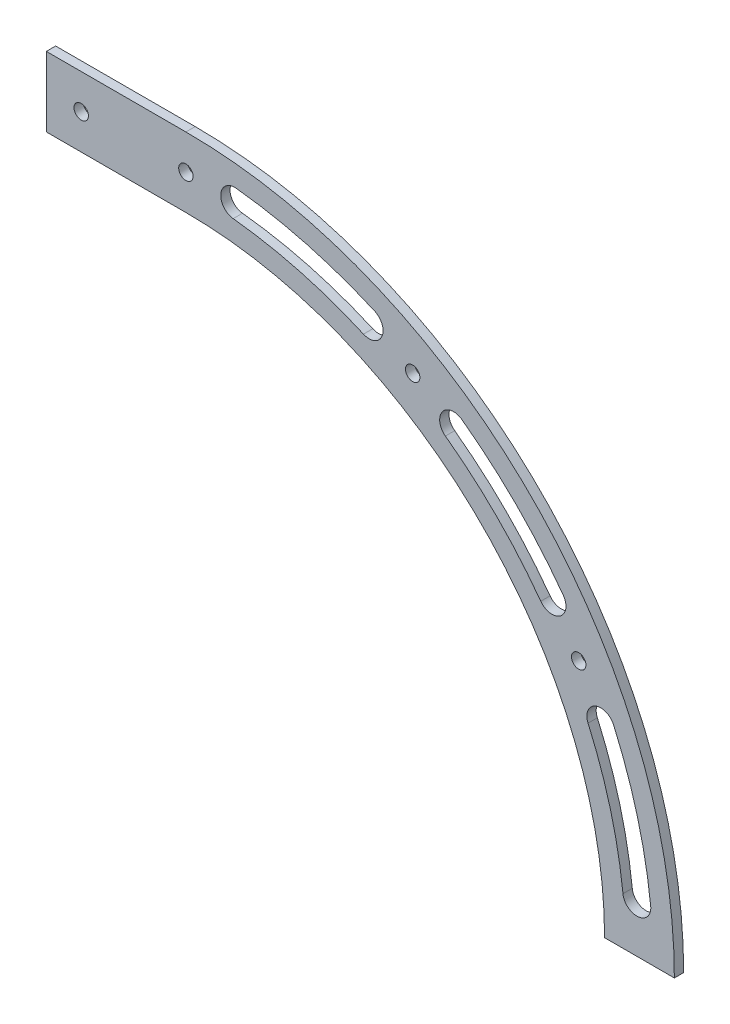
ISO-10303-21;
HEADER;
FILE_DESCRIPTION(('STEP AP214'),'2;1');
FILE_NAME('part.step','',(''),(''),'','','');
FILE_SCHEMA(('AUTOMOTIVE_DESIGN { 1 0 10303 214 1 1 1 1 }'));
ENDSEC;
DATA;
#1=APPLICATION_CONTEXT('core data for automotive mechanical design processes');
#2=APPLICATION_PROTOCOL_DEFINITION('international standard','automotive_design',2000,#1);
#3=PRODUCT_CONTEXT('',#1,'mechanical');
#4=PRODUCT('Part','Part','',(#3));
#5=PRODUCT_RELATED_PRODUCT_CATEGORY('part','',(#4));
#6=PRODUCT_DEFINITION_FORMATION('','',#4);
#7=PRODUCT_DEFINITION_CONTEXT('part definition',#1,'design');
#8=PRODUCT_DEFINITION('design','',#6,#7);
#9=PRODUCT_DEFINITION_SHAPE('','',#8);
#10=(LENGTH_UNIT() NAMED_UNIT(*) SI_UNIT(.MILLI.,.METRE.));
#11=(NAMED_UNIT(*) PLANE_ANGLE_UNIT() SI_UNIT($,.RADIAN.));
#12=(NAMED_UNIT(*) SI_UNIT($,.STERADIAN.) SOLID_ANGLE_UNIT());
#13=UNCERTAINTY_MEASURE_WITH_UNIT(LENGTH_MEASURE(1.E-05),#10,'distance_accuracy_value','');
#14=(GEOMETRIC_REPRESENTATION_CONTEXT(3) GLOBAL_UNCERTAINTY_ASSIGNED_CONTEXT((#13)) GLOBAL_UNIT_ASSIGNED_CONTEXT((#10,
#11,#12)) REPRESENTATION_CONTEXT('',''));
#15=CARTESIAN_POINT('',(0.,0.,0.));
#16=DIRECTION('',(0.,0.,1.));
#17=DIRECTION('',(1.,0.,0.));
#18=AXIS2_PLACEMENT_3D('',#15,#16,#17);
#19=CARTESIAN_POINT('',(0.,0.,0.));
#20=DIRECTION('',(0.,0.,1.));
#21=DIRECTION('',(-1.,0.,0.));
#22=AXIS2_PLACEMENT_3D('',#19,#20,#21);
#23=PLANE('',#22);
#24=CARTESIAN_POINT('',(0.,97.4999999999999,0.));
#25=DIRECTION('',(0.,0.,1.));
#26=DIRECTION('',(1.,0.,0.));
#27=AXIS2_PLACEMENT_3D('',#24,#25,#26);
#28=CIRCLE('',#27,1.55);
#29=CARTESIAN_POINT('',(1.55,97.4999999999999,0.));
#30=VERTEX_POINT('',#29);
#31=EDGE_CURVE('E467',#30,#30,#28,.T.);
#32=ORIENTED_EDGE('',*,*,#31,.F.);
#33=EDGE_LOOP('',(#32));
#34=FACE_BOUND('',#33,.T.);
#35=CARTESIAN_POINT('',(-22.5,97.4999999999999,0.));
#36=DIRECTION('',(0.,0.,1.));
#37=DIRECTION('',(1.,0.,0.));
#38=AXIS2_PLACEMENT_3D('',#35,#36,#37);
#39=CIRCLE('',#38,1.55);
#40=CARTESIAN_POINT('',(-20.95,97.4999999999999,0.));
#41=VERTEX_POINT('',#40);
#42=EDGE_CURVE('E483',#41,#41,#39,.T.);
#43=ORIENTED_EDGE('',*,*,#42,.F.);
#44=EDGE_LOOP('',(#43));
#45=FACE_BOUND('',#44,.T.);
#46=CARTESIAN_POINT('',(39.382176801012,89.1924556810375,0.));
#47=DIRECTION('',(0.,0.,-1.));
#48=DIRECTION('',(-1.,0.,0.));
#49=AXIS2_PLACEMENT_3D('',#46,#47,#48);
#50=CIRCLE('',#49,3.);
#51=CARTESIAN_POINT('',(40.593936087197,91.9368389327617,0.));
#52=VERTEX_POINT('',#51);
#53=CARTESIAN_POINT('',(38.170417514827,86.4480724293132,0.));
#54=VERTEX_POINT('',#53);
#55=EDGE_CURVE('E11',#52,#54,#50,.T.);
#56=ORIENTED_EDGE('',*,*,#55,.T.);
#57=CARTESIAN_POINT('',(0.,0.,0.));
#58=DIRECTION('',(0.,0.,-1.));
#59=DIRECTION('',(-1.,0.,0.));
#60=AXIS2_PLACEMENT_3D('',#57,#58,#59);
#61=CIRCLE('',#60,94.5);
#62=CARTESIAN_POINT('',(10.1674849737587,93.9514355893958,0.));
#63=VERTEX_POINT('',#62);
#64=EDGE_CURVE('E56',#54,#63,#61,.F.);
#65=ORIENTED_EDGE('',*,*,#64,.T.);
#66=CARTESIAN_POINT('',(10.4902622745129,96.934020846202,0.));
#67=DIRECTION('',(0.,0.,-1.));
#68=DIRECTION('',(-1.,0.,0.));
#69=AXIS2_PLACEMENT_3D('',#66,#67,#68);
#70=CIRCLE('',#69,3.);
#71=CARTESIAN_POINT('',(10.8130395752672,99.9166061030083,0.));
#72=VERTEX_POINT('',#71);
#73=EDGE_CURVE('E380',#63,#72,#70,.T.);
#74=ORIENTED_EDGE('',*,*,#73,.T.);
#75=CARTESIAN_POINT('',(0.,0.,0.));
#76=DIRECTION('',(0.,0.,-1.));
#77=DIRECTION('',(-1.,0.,0.));
#78=AXIS2_PLACEMENT_3D('',#75,#76,#77);
#79=CIRCLE('',#78,100.5);
#80=EDGE_CURVE('E370',#72,#52,#79,.T.);
#81=ORIENTED_EDGE('',*,*,#80,.T.);
#82=EDGE_LOOP('',(#56,#65,#74,#81));
#83=FACE_BOUND('',#82,.T.);
#84=CARTESIAN_POINT('',(84.4374768689824,48.7500000000007,0.));
#85=DIRECTION('',(0.,0.,-1.));
#86=DIRECTION('',(-1.,0.,0.));
#87=AXIS2_PLACEMENT_3D('',#84,#85,#86);
#88=CIRCLE('',#87,1.54999999999999);
#89=CARTESIAN_POINT('',(82.8874768689824,48.7500000000007,0.));
#90=VERTEX_POINT('',#89);
#91=EDGE_CURVE('E322',#90,#90,#88,.T.);
#92=ORIENTED_EDGE('',*,*,#91,.T.);
#93=EDGE_LOOP('',(#92));
#94=FACE_BOUND('',#93,.T.);
#95=CARTESIAN_POINT('',(48.7500000000004,84.4374768689825,0.));
#96=DIRECTION('',(0.,0.,-1.));
#97=DIRECTION('',(-1.,0.,0.));
#98=AXIS2_PLACEMENT_3D('',#95,#96,#97);
#99=CIRCLE('',#98,1.54999999999999);
#100=CARTESIAN_POINT('',(47.2000000000004,84.4374768689825,0.));
#101=VERTEX_POINT('',#100);
#102=EDGE_CURVE('E275',#101,#101,#99,.T.);
#103=ORIENTED_EDGE('',*,*,#102,.T.);
#104=EDGE_LOOP('',(#103));
#105=FACE_BOUND('',#104,.T.);
#106=CARTESIAN_POINT('',(96.9340208462021,10.4902622745126,0.));
#107=DIRECTION('',(0.,0.,-1.));
#108=DIRECTION('',(-1.,0.,0.));
#109=AXIS2_PLACEMENT_3D('',#106,#107,#108);
#110=CIRCLE('',#109,3.);
#111=CARTESIAN_POINT('',(99.9166061030083,10.8130395752669,0.));
#112=VERTEX_POINT('',#111);
#113=CARTESIAN_POINT('',(93.9514355893959,10.1674849737584,0.));
#114=VERTEX_POINT('',#113);
#115=EDGE_CURVE('E366',#112,#114,#110,.T.);
#116=ORIENTED_EDGE('',*,*,#115,.T.);
#117=CARTESIAN_POINT('',(0.,0.,0.));
#118=DIRECTION('',(0.,0.,-1.));
#119=DIRECTION('',(-1.,0.,0.));
#120=AXIS2_PLACEMENT_3D('',#117,#118,#119);
#121=CIRCLE('',#120,94.5);
#122=CARTESIAN_POINT('',(86.4480724293134,38.1704175148268,0.));
#123=VERTEX_POINT('',#122);
#124=EDGE_CURVE('E362',#114,#123,#121,.F.);
#125=ORIENTED_EDGE('',*,*,#124,.T.);
#126=CARTESIAN_POINT('',(89.1924556810376,39.3821768010117,0.));
#127=DIRECTION('',(0.,0.,-1.));
#128=DIRECTION('',(-1.,0.,0.));
#129=AXIS2_PLACEMENT_3D('',#126,#127,#128);
#130=CIRCLE('',#129,3.);
#131=CARTESIAN_POINT('',(91.9368389327618,40.5939360871967,0.));
#132=VERTEX_POINT('',#131);
#133=EDGE_CURVE('E358',#123,#132,#130,.T.);
#134=ORIENTED_EDGE('',*,*,#133,.T.);
#135=CARTESIAN_POINT('',(0.,0.,0.));
#136=DIRECTION('',(0.,0.,-1.));
#137=DIRECTION('',(-1.,0.,0.));
#138=AXIS2_PLACEMENT_3D('',#135,#136,#137);
#139=CIRCLE('',#138,100.5);
#140=EDGE_CURVE('E354',#132,#112,#139,.T.);
#141=ORIENTED_EDGE('',*,*,#140,.T.);
#142=EDGE_LOOP('',(#116,#125,#134,#141));
#143=FACE_BOUND('',#142,.T.);
#144=CARTESIAN_POINT('',(78.702193406525,57.5518440451906,0.));
#145=DIRECTION('',(0.,0.,-1.));
#146=DIRECTION('',(-1.,0.,0.));
#147=AXIS2_PLACEMENT_3D('',#144,#145,#146);
#148=CIRCLE('',#147,2.99999999999999);
#149=CARTESIAN_POINT('',(81.1237993574949,59.3226700158118,0.));
#150=VERTEX_POINT('',#149);
#151=CARTESIAN_POINT('',(76.280587455555,55.7810180745693,0.));
#152=VERTEX_POINT('',#151);
#153=EDGE_CURVE('E350',#150,#152,#148,.T.);
#154=ORIENTED_EDGE('',*,*,#153,.T.);
#155=CARTESIAN_POINT('',(0.,0.,0.));
#156=DIRECTION('',(0.,0.,-1.));
#157=DIRECTION('',(-1.,0.,0.));
#158=AXIS2_PLACEMENT_3D('',#155,#156,#157);
#159=CIRCLE('',#158,94.5);
#160=CARTESIAN_POINT('',(55.781018074569,76.2805874555552,0.));
#161=VERTEX_POINT('',#160);
#162=EDGE_CURVE('E346',#152,#161,#159,.F.);
#163=ORIENTED_EDGE('',*,*,#162,.T.);
#164=CARTESIAN_POINT('',(57.5518440451903,78.7021934065252,0.));
#165=DIRECTION('',(0.,0.,-1.));
#166=DIRECTION('',(-1.,0.,0.));
#167=AXIS2_PLACEMENT_3D('',#164,#165,#166);
#168=CIRCLE('',#167,2.99999999999999);
#169=CARTESIAN_POINT('',(59.3226700158115,81.1237993574952,0.));
#170=VERTEX_POINT('',#169);
#171=EDGE_CURVE('E342',#161,#170,#168,.T.);
#172=ORIENTED_EDGE('',*,*,#171,.T.);
#173=CARTESIAN_POINT('',(0.,0.,0.));
#174=DIRECTION('',(0.,0.,-1.));
#175=DIRECTION('',(-1.,0.,0.));
#176=AXIS2_PLACEMENT_3D('',#173,#174,#175);
#177=CIRCLE('',#176,100.5);
#178=EDGE_CURVE('E338',#170,#150,#177,.T.);
#179=ORIENTED_EDGE('',*,*,#178,.T.);
#180=EDGE_LOOP('',(#154,#163,#172,#179));
#181=FACE_BOUND('',#180,.T.);
#182=CARTESIAN_POINT('',(0.,0.,0.));
#183=DIRECTION('',(0.,0.,1.));
#184=DIRECTION('',(-1.,0.,0.));
#185=AXIS2_PLACEMENT_3D('',#182,#183,#184);
#186=CIRCLE('',#185,105.);
#187=CARTESIAN_POINT('',(105.,0.,0.));
#188=VERTEX_POINT('',#187);
#189=CARTESIAN_POINT('',(0.,105.,0.));
#190=VERTEX_POINT('',#189);
#191=EDGE_CURVE('E197',#188,#190,#186,.T.);
#192=ORIENTED_EDGE('',*,*,#191,.T.);
#193=DIRECTION('',(-1.,0.,0.));
#194=VECTOR('',#193,1.);
#195=CARTESIAN_POINT('',(-3.66605540578529E-13,105.,0.));
#196=LINE('',#195,#194);
#197=CARTESIAN_POINT('',(-30.,105.,0.));
#198=VERTEX_POINT('',#197);
#199=EDGE_CURVE('E178',#190,#198,#196,.T.);
#200=ORIENTED_EDGE('',*,*,#199,.T.);
#201=DIRECTION('',(0.,-1.,0.));
#202=VECTOR('',#201,1.);
#203=CARTESIAN_POINT('',(-30.,105.,0.));
#204=LINE('',#203,#202);
#205=CARTESIAN_POINT('',(-30.,89.9999999999999,0.));
#206=VERTEX_POINT('',#205);
#207=EDGE_CURVE('E185',#198,#206,#204,.T.);
#208=ORIENTED_EDGE('',*,*,#207,.T.);
#209=DIRECTION('',(1.,0.,0.));
#210=VECTOR('',#209,1.);
#211=CARTESIAN_POINT('',(-3.66605540578529E-13,89.9999999999999,0.));
#212=LINE('',#211,#210);
#213=CARTESIAN_POINT('',(-3.66605540578529E-13,89.9999999999999,0.));
#214=VERTEX_POINT('',#213);
#215=EDGE_CURVE('E207',#206,#214,#212,.T.);
#216=ORIENTED_EDGE('',*,*,#215,.T.);
#217=CARTESIAN_POINT('',(0.,0.,0.));
#218=DIRECTION('',(0.,0.,-1.));
#219=DIRECTION('',(-1.,0.,0.));
#220=AXIS2_PLACEMENT_3D('',#217,#218,#219);
#221=CIRCLE('',#220,90.);
#222=CARTESIAN_POINT('',(90.,0.,0.));
#223=VERTEX_POINT('',#222);
#224=EDGE_CURVE('E321',#214,#223,#221,.T.);
#225=ORIENTED_EDGE('',*,*,#224,.T.);
#226=DIRECTION('',(-1.,0.,0.));
#227=VECTOR('',#226,1.);
#228=CARTESIAN_POINT('',(0.,0.,0.));
#229=LINE('',#228,#227);
#230=EDGE_CURVE('E266',#188,#223,#229,.T.);
#231=ORIENTED_EDGE('',*,*,#230,.F.);
#232=EDGE_LOOP('',(#192,#200,#208,#216,#225,#231));
#233=FACE_BOUND('',#232,.T.);
#234=ADVANCED_FACE('F47',(#34,#45,#83,#94,#105,#143,#181,#233),#23,.T.);
#235=CARTESIAN_POINT('',(0.,0.,-15.));
#236=DIRECTION('',(0.,0.,1.));
#237=DIRECTION('',(-1.,0.,0.));
#238=AXIS2_PLACEMENT_3D('',#235,#236,#237);
#239=CYLINDRICAL_SURFACE('',#238,105.);
#240=DIRECTION('',(0.,0.,1.));
#241=VECTOR('',#240,1.);
#242=CARTESIAN_POINT('',(0.,105.,-15.));
#243=LINE('',#242,#241);
#244=CARTESIAN_POINT('',(0.,105.,-2.));
#245=VERTEX_POINT('',#244);
#246=EDGE_CURVE('E335',#245,#190,#243,.T.);
#247=ORIENTED_EDGE('',*,*,#246,.T.);
#248=ORIENTED_EDGE('',*,*,#191,.F.);
#249=DIRECTION('',(0.,0.,1.));
#250=VECTOR('',#249,1.);
#251=CARTESIAN_POINT('',(105.,0.,-15.));
#252=LINE('',#251,#250);
#253=CARTESIAN_POINT('',(105.,0.,-2.));
#254=VERTEX_POINT('',#253);
#255=EDGE_CURVE('E326',#254,#188,#252,.T.);
#256=ORIENTED_EDGE('',*,*,#255,.F.);
#257=CARTESIAN_POINT('',(0.,0.,-2.));
#258=DIRECTION('',(0.,0.,1.));
#259=DIRECTION('',(-1.,0.,0.));
#260=AXIS2_PLACEMENT_3D('',#257,#258,#259);
#261=CIRCLE('',#260,105.);
#262=EDGE_CURVE('E209',#254,#245,#261,.T.);
#263=ORIENTED_EDGE('',*,*,#262,.T.);
#264=EDGE_LOOP('',(#247,#248,#256,#263));
#265=FACE_BOUND('',#264,.T.);
#266=ADVANCED_FACE('F49',(#265),#239,.T.);
#267=CARTESIAN_POINT('',(0.,0.,-15.));
#268=DIRECTION('',(0.,0.,1.));
#269=DIRECTION('',(-1.,0.,0.));
#270=AXIS2_PLACEMENT_3D('',#267,#268,#269);
#271=CYLINDRICAL_SURFACE('',#270,90.);
#272=DIRECTION('',(0.,0.,1.));
#273=VECTOR('',#272,1.);
#274=CARTESIAN_POINT('',(90.,0.,-15.));
#275=LINE('',#274,#273);
#276=CARTESIAN_POINT('',(90.,0.,-2.));
#277=VERTEX_POINT('',#276);
#278=EDGE_CURVE('E329',#277,#223,#275,.T.);
#279=ORIENTED_EDGE('',*,*,#278,.T.);
#280=ORIENTED_EDGE('',*,*,#224,.F.);
#281=DIRECTION('',(0.,0.,1.));
#282=VECTOR('',#281,1.);
#283=CARTESIAN_POINT('',(0.,90.,-15.));
#284=LINE('',#283,#282);
#285=CARTESIAN_POINT('',(0.,90.,-2.));
#286=VERTEX_POINT('',#285);
#287=EDGE_CURVE('E332',#286,#214,#284,.T.);
#288=ORIENTED_EDGE('',*,*,#287,.F.);
#289=CARTESIAN_POINT('',(0.,0.,-2.));
#290=DIRECTION('',(0.,0.,-1.));
#291=DIRECTION('',(-1.,0.,0.));
#292=AXIS2_PLACEMENT_3D('',#289,#290,#291);
#293=CIRCLE('',#292,90.);
#294=EDGE_CURVE('E216',#286,#277,#293,.T.);
#295=ORIENTED_EDGE('',*,*,#294,.T.);
#296=EDGE_LOOP('',(#279,#280,#288,#295));
#297=FACE_BOUND('',#296,.T.);
#298=ADVANCED_FACE('F442',(#297),#271,.F.);
#299=CARTESIAN_POINT('',(78.702193406525,57.5518440451906,50.));
#300=DIRECTION('',(0.,0.,-1.));
#301=DIRECTION('',(1.,0.,0.));
#302=AXIS2_PLACEMENT_3D('',#299,#300,#301);
#303=CYLINDRICAL_SURFACE('',#302,2.99999999999999);
#304=DIRECTION('',(0.,0.,-1.));
#305=VECTOR('',#304,1.);
#306=CARTESIAN_POINT('',(76.280587455555,55.7810180745693,50.));
#307=LINE('',#306,#305);
#308=CARTESIAN_POINT('',(76.280587455555,55.7810180745693,-2.));
#309=VERTEX_POINT('',#308);
#310=EDGE_CURVE('E300',#152,#309,#307,.T.);
#311=ORIENTED_EDGE('',*,*,#310,.F.);
#312=ORIENTED_EDGE('',*,*,#153,.F.);
#313=DIRECTION('',(0.,0.,-1.));
#314=VECTOR('',#313,1.);
#315=CARTESIAN_POINT('',(81.1237993574949,59.3226700158118,50.));
#316=LINE('',#315,#314);
#317=CARTESIAN_POINT('',(81.1237993574949,59.3226700158118,-2.));
#318=VERTEX_POINT('',#317);
#319=EDGE_CURVE('E288',#150,#318,#316,.T.);
#320=ORIENTED_EDGE('',*,*,#319,.T.);
#321=CARTESIAN_POINT('',(78.702193406525,57.5518440451906,-2.));
#322=DIRECTION('',(0.,0.,-1.));
#323=DIRECTION('',(-1.,0.,0.));
#324=AXIS2_PLACEMENT_3D('',#321,#322,#323);
#325=CIRCLE('',#324,2.99999999999999);
#326=EDGE_CURVE('E263',#309,#318,#325,.F.);
#327=ORIENTED_EDGE('',*,*,#326,.F.);
#328=EDGE_LOOP('',(#311,#312,#320,#327));
#329=FACE_BOUND('',#328,.T.);
#330=ADVANCED_FACE('F416',(#329),#303,.F.);
#331=CARTESIAN_POINT('',(0.,0.,50.));
#332=DIRECTION('',(0.,0.,-1.));
#333=DIRECTION('',(1.,0.,0.));
#334=AXIS2_PLACEMENT_3D('',#331,#332,#333);
#335=CYLINDRICAL_SURFACE('',#334,94.5);
#336=DIRECTION('',(0.,0.,-1.));
#337=VECTOR('',#336,1.);
#338=CARTESIAN_POINT('',(55.781018074569,76.2805874555552,50.));
#339=LINE('',#338,#337);
#340=CARTESIAN_POINT('',(55.781018074569,76.2805874555552,-2.));
#341=VERTEX_POINT('',#340);
#342=EDGE_CURVE('E296',#161,#341,#339,.T.);
#343=ORIENTED_EDGE('',*,*,#342,.F.);
#344=ORIENTED_EDGE('',*,*,#162,.F.);
#345=ORIENTED_EDGE('',*,*,#310,.T.);
#346=CARTESIAN_POINT('',(0.,0.,-2.));
#347=DIRECTION('',(0.,0.,-1.));
#348=DIRECTION('',(-1.,0.,0.));
#349=AXIS2_PLACEMENT_3D('',#346,#347,#348);
#350=CIRCLE('',#349,94.5);
#351=EDGE_CURVE('E260',#341,#309,#350,.T.);
#352=ORIENTED_EDGE('',*,*,#351,.F.);
#353=EDGE_LOOP('',(#343,#344,#345,#352));
#354=FACE_BOUND('',#353,.T.);
#355=ADVANCED_FACE('F419',(#354),#335,.T.);
#356=CARTESIAN_POINT('',(57.5518440451903,78.7021934065252,50.));
#357=DIRECTION('',(0.,0.,-1.));
#358=DIRECTION('',(1.,0.,0.));
#359=AXIS2_PLACEMENT_3D('',#356,#357,#358);
#360=CYLINDRICAL_SURFACE('',#359,2.99999999999999);
#361=DIRECTION('',(0.,0.,-1.));
#362=VECTOR('',#361,1.);
#363=CARTESIAN_POINT('',(59.3226700158115,81.1237993574952,50.));
#364=LINE('',#363,#362);
#365=CARTESIAN_POINT('',(59.3226700158115,81.1237993574952,-2.));
#366=VERTEX_POINT('',#365);
#367=EDGE_CURVE('E292',#170,#366,#364,.T.);
#368=ORIENTED_EDGE('',*,*,#367,.F.);
#369=ORIENTED_EDGE('',*,*,#171,.F.);
#370=ORIENTED_EDGE('',*,*,#342,.T.);
#371=CARTESIAN_POINT('',(57.5518440451903,78.7021934065252,-2.));
#372=DIRECTION('',(0.,0.,-1.));
#373=DIRECTION('',(-1.,0.,0.));
#374=AXIS2_PLACEMENT_3D('',#371,#372,#373);
#375=CIRCLE('',#374,2.99999999999999);
#376=EDGE_CURVE('E257',#366,#341,#375,.F.);
#377=ORIENTED_EDGE('',*,*,#376,.F.);
#378=EDGE_LOOP('',(#368,#369,#370,#377));
#379=FACE_BOUND('',#378,.T.);
#380=ADVANCED_FACE('F426',(#379),#360,.F.);
#381=CARTESIAN_POINT('',(0.,0.,50.));
#382=DIRECTION('',(0.,0.,-1.));
#383=DIRECTION('',(1.,0.,0.));
#384=AXIS2_PLACEMENT_3D('',#381,#382,#383);
#385=CYLINDRICAL_SURFACE('',#384,100.5);
#386=ORIENTED_EDGE('',*,*,#319,.F.);
#387=ORIENTED_EDGE('',*,*,#178,.F.);
#388=ORIENTED_EDGE('',*,*,#367,.T.);
#389=CARTESIAN_POINT('',(0.,0.,-2.));
#390=DIRECTION('',(0.,0.,-1.));
#391=DIRECTION('',(-1.,0.,0.));
#392=AXIS2_PLACEMENT_3D('',#389,#390,#391);
#393=CIRCLE('',#392,100.5);
#394=EDGE_CURVE('E63',#318,#366,#393,.F.);
#395=ORIENTED_EDGE('',*,*,#394,.F.);
#396=EDGE_LOOP('',(#386,#387,#388,#395));
#397=FACE_BOUND('',#396,.T.);
#398=ADVANCED_FACE('F424',(#397),#385,.F.);
#399=CARTESIAN_POINT('',(96.9340208462021,10.4902622745126,50.));
#400=DIRECTION('',(0.,0.,-1.));
#401=DIRECTION('',(1.,0.,0.));
#402=AXIS2_PLACEMENT_3D('',#399,#400,#401);
#403=CYLINDRICAL_SURFACE('',#402,3.);
#404=DIRECTION('',(0.,0.,-1.));
#405=VECTOR('',#404,1.);
#406=CARTESIAN_POINT('',(93.9514355893959,10.1674849737584,50.));
#407=LINE('',#406,#405);
#408=CARTESIAN_POINT('',(93.9514355893959,10.1674849737584,-2.));
#409=VERTEX_POINT('',#408);
#410=EDGE_CURVE('E270',#114,#409,#407,.T.);
#411=ORIENTED_EDGE('',*,*,#410,.F.);
#412=ORIENTED_EDGE('',*,*,#115,.F.);
#413=DIRECTION('',(0.,0.,-1.));
#414=VECTOR('',#413,1.);
#415=CARTESIAN_POINT('',(99.9166061030083,10.8130395752669,50.));
#416=LINE('',#415,#414);
#417=CARTESIAN_POINT('',(99.9166061030083,10.8130395752669,-2.));
#418=VERTEX_POINT('',#417);
#419=EDGE_CURVE('E304',#112,#418,#416,.T.);
#420=ORIENTED_EDGE('',*,*,#419,.T.);
#421=CARTESIAN_POINT('',(96.9340208462021,10.4902622745126,-2.));
#422=DIRECTION('',(0.,0.,-1.));
#423=DIRECTION('',(-1.,0.,0.));
#424=AXIS2_PLACEMENT_3D('',#421,#422,#423);
#425=CIRCLE('',#424,3.);
#426=EDGE_CURVE('E252',#409,#418,#425,.F.);
#427=ORIENTED_EDGE('',*,*,#426,.F.);
#428=EDGE_LOOP('',(#411,#412,#420,#427));
#429=FACE_BOUND('',#428,.T.);
#430=ADVANCED_FACE('F433',(#429),#403,.F.);
#431=CARTESIAN_POINT('',(0.,0.,50.));
#432=DIRECTION('',(0.,0.,-1.));
#433=DIRECTION('',(1.,0.,0.));
#434=AXIS2_PLACEMENT_3D('',#431,#432,#433);
#435=CYLINDRICAL_SURFACE('',#434,94.5);
#436=DIRECTION('',(0.,0.,-1.));
#437=VECTOR('',#436,1.);
#438=CARTESIAN_POINT('',(86.4480724293134,38.1704175148268,50.));
#439=LINE('',#438,#437);
#440=CARTESIAN_POINT('',(86.4480724293134,38.1704175148268,-2.));
#441=VERTEX_POINT('',#440);
#442=EDGE_CURVE('E312',#123,#441,#439,.T.);
#443=ORIENTED_EDGE('',*,*,#442,.F.);
#444=ORIENTED_EDGE('',*,*,#124,.F.);
#445=ORIENTED_EDGE('',*,*,#410,.T.);
#446=CARTESIAN_POINT('',(0.,0.,-2.));
#447=DIRECTION('',(0.,0.,-1.));
#448=DIRECTION('',(-1.,0.,0.));
#449=AXIS2_PLACEMENT_3D('',#446,#447,#448);
#450=CIRCLE('',#449,94.5);
#451=EDGE_CURVE('E249',#441,#409,#450,.T.);
#452=ORIENTED_EDGE('',*,*,#451,.F.);
#453=EDGE_LOOP('',(#443,#444,#445,#452));
#454=FACE_BOUND('',#453,.T.);
#455=ADVANCED_FACE('F447',(#454),#435,.T.);
#456=CARTESIAN_POINT('',(89.1924556810376,39.3821768010117,50.));
#457=DIRECTION('',(0.,0.,-1.));
#458=DIRECTION('',(1.,0.,0.));
#459=AXIS2_PLACEMENT_3D('',#456,#457,#458);
#460=CYLINDRICAL_SURFACE('',#459,3.);
#461=DIRECTION('',(0.,0.,-1.));
#462=VECTOR('',#461,1.);
#463=CARTESIAN_POINT('',(91.9368389327619,40.5939360871967,50.));
#464=LINE('',#463,#462);
#465=CARTESIAN_POINT('',(91.9368389327619,40.5939360871967,-2.));
#466=VERTEX_POINT('',#465);
#467=EDGE_CURVE('E308',#132,#466,#464,.T.);
#468=ORIENTED_EDGE('',*,*,#467,.F.);
#469=ORIENTED_EDGE('',*,*,#133,.F.);
#470=ORIENTED_EDGE('',*,*,#442,.T.);
#471=CARTESIAN_POINT('',(89.1924556810376,39.3821768010117,-2.));
#472=DIRECTION('',(0.,0.,-1.));
#473=DIRECTION('',(-1.,0.,0.));
#474=AXIS2_PLACEMENT_3D('',#471,#472,#473);
#475=CIRCLE('',#474,3.);
#476=EDGE_CURVE('E246',#466,#441,#475,.F.);
#477=ORIENTED_EDGE('',*,*,#476,.F.);
#478=EDGE_LOOP('',(#468,#469,#470,#477));
#479=FACE_BOUND('',#478,.T.);
#480=ADVANCED_FACE('F513',(#479),#460,.F.);
#481=CARTESIAN_POINT('',(0.,0.,50.));
#482=DIRECTION('',(0.,0.,-1.));
#483=DIRECTION('',(1.,0.,0.));
#484=AXIS2_PLACEMENT_3D('',#481,#482,#483);
#485=CYLINDRICAL_SURFACE('',#484,100.5);
#486=ORIENTED_EDGE('',*,*,#419,.F.);
#487=ORIENTED_EDGE('',*,*,#140,.F.);
#488=ORIENTED_EDGE('',*,*,#467,.T.);
#489=CARTESIAN_POINT('',(0.,0.,-2.));
#490=DIRECTION('',(0.,0.,-1.));
#491=DIRECTION('',(-1.,0.,0.));
#492=AXIS2_PLACEMENT_3D('',#489,#490,#491);
#493=CIRCLE('',#492,100.5);
#494=EDGE_CURVE('E71',#418,#466,#493,.F.);
#495=ORIENTED_EDGE('',*,*,#494,.F.);
#496=EDGE_LOOP('',(#486,#487,#488,#495));
#497=FACE_BOUND('',#496,.T.);
#498=ADVANCED_FACE('F515',(#497),#485,.F.);
#499=CARTESIAN_POINT('',(48.7500000000004,84.4374768689825,50.));
#500=DIRECTION('',(0.,0.,-1.));
#501=DIRECTION('',(1.,0.,0.));
#502=AXIS2_PLACEMENT_3D('',#499,#500,#501);
#503=CYLINDRICAL_SURFACE('',#502,1.54999999999999);
#504=CARTESIAN_POINT('',(48.7500000000004,84.4374768689825,-2.));
#505=DIRECTION('',(0.,0.,-1.));
#506=DIRECTION('',(-1.,0.,0.));
#507=AXIS2_PLACEMENT_3D('',#504,#505,#506);
#508=CIRCLE('',#507,1.54999999999999);
#509=CARTESIAN_POINT('',(47.2000000000004,84.4374768689825,-2.));
#510=VERTEX_POINT('',#509);
#511=EDGE_CURVE('E240',#510,#510,#508,.F.);
#512=ORIENTED_EDGE('',*,*,#511,.F.);
#513=EDGE_LOOP('',(#512));
#514=FACE_BOUND('',#513,.T.);
#515=ORIENTED_EDGE('',*,*,#102,.F.);
#516=EDGE_LOOP('',(#515));
#517=FACE_BOUND('',#516,.T.);
#518=ADVANCED_FACE('F500',(#514,#517),#503,.F.);
#519=CARTESIAN_POINT('',(84.4374768689824,48.7500000000007,50.));
#520=DIRECTION('',(0.,0.,-1.));
#521=DIRECTION('',(1.,0.,0.));
#522=AXIS2_PLACEMENT_3D('',#519,#520,#521);
#523=CYLINDRICAL_SURFACE('',#522,1.54999999999999);
#524=CARTESIAN_POINT('',(84.4374768689824,48.7500000000007,-2.));
#525=DIRECTION('',(0.,0.,-1.));
#526=DIRECTION('',(-1.,0.,0.));
#527=AXIS2_PLACEMENT_3D('',#524,#525,#526);
#528=CIRCLE('',#527,1.54999999999999);
#529=CARTESIAN_POINT('',(82.8874768689824,48.7500000000007,-2.));
#530=VERTEX_POINT('',#529);
#531=EDGE_CURVE('E236',#530,#530,#528,.F.);
#532=ORIENTED_EDGE('',*,*,#531,.F.);
#533=EDGE_LOOP('',(#532));
#534=FACE_BOUND('',#533,.T.);
#535=ORIENTED_EDGE('',*,*,#91,.F.);
#536=EDGE_LOOP('',(#535));
#537=FACE_BOUND('',#536,.T.);
#538=ADVANCED_FACE('F497',(#534,#537),#523,.F.);
#539=CARTESIAN_POINT('',(39.382176801012,89.1924556810375,50.));
#540=DIRECTION('',(0.,0.,-1.));
#541=DIRECTION('',(1.,0.,0.));
#542=AXIS2_PLACEMENT_3D('',#539,#540,#541);
#543=CYLINDRICAL_SURFACE('',#542,3.);
#544=DIRECTION('',(0.,0.,-1.));
#545=VECTOR('',#544,1.);
#546=CARTESIAN_POINT('',(38.170417514827,86.4480724293132,50.));
#547=LINE('',#546,#545);
#548=CARTESIAN_POINT('',(38.170417514827,86.4480724293132,-2.));
#549=VERTEX_POINT('',#548);
#550=EDGE_CURVE('E271',#54,#549,#547,.T.);
#551=ORIENTED_EDGE('',*,*,#550,.F.);
#552=ORIENTED_EDGE('',*,*,#55,.F.);
#553=DIRECTION('',(0.,0.,-1.));
#554=VECTOR('',#553,1.);
#555=CARTESIAN_POINT('',(40.593936087197,91.9368389327617,50.));
#556=LINE('',#555,#554);
#557=CARTESIAN_POINT('',(40.593936087197,91.9368389327617,-2.));
#558=VERTEX_POINT('',#557);
#559=EDGE_CURVE('E284',#52,#558,#556,.T.);
#560=ORIENTED_EDGE('',*,*,#559,.T.);
#561=CARTESIAN_POINT('',(39.382176801012,89.1924556810375,-2.));
#562=DIRECTION('',(0.,0.,-1.));
#563=DIRECTION('',(-1.,0.,0.));
#564=AXIS2_PLACEMENT_3D('',#561,#562,#563);
#565=CIRCLE('',#564,3.);
#566=EDGE_CURVE('E232',#549,#558,#565,.F.);
#567=ORIENTED_EDGE('',*,*,#566,.F.);
#568=EDGE_LOOP('',(#551,#552,#560,#567));
#569=FACE_BOUND('',#568,.T.);
#570=ADVANCED_FACE('F400',(#569),#543,.F.);
#571=CARTESIAN_POINT('',(0.,0.,50.));
#572=DIRECTION('',(0.,0.,-1.));
#573=DIRECTION('',(1.,0.,0.));
#574=AXIS2_PLACEMENT_3D('',#571,#572,#573);
#575=CYLINDRICAL_SURFACE('',#574,94.5);
#576=DIRECTION('',(0.,0.,-1.));
#577=VECTOR('',#576,1.);
#578=CARTESIAN_POINT('',(10.1674849737587,93.9514355893958,50.));
#579=LINE('',#578,#577);
#580=CARTESIAN_POINT('',(10.1674849737587,93.9514355893958,-2.));
#581=VERTEX_POINT('',#580);
#582=EDGE_CURVE('E276',#63,#581,#579,.T.);
#583=ORIENTED_EDGE('',*,*,#582,.F.);
#584=ORIENTED_EDGE('',*,*,#64,.F.);
#585=ORIENTED_EDGE('',*,*,#550,.T.);
#586=CARTESIAN_POINT('',(0.,0.,-2.));
#587=DIRECTION('',(0.,0.,-1.));
#588=DIRECTION('',(-1.,0.,0.));
#589=AXIS2_PLACEMENT_3D('',#586,#587,#588);
#590=CIRCLE('',#589,94.5);
#591=EDGE_CURVE('E229',#581,#549,#590,.T.);
#592=ORIENTED_EDGE('',*,*,#591,.F.);
#593=EDGE_LOOP('',(#583,#584,#585,#592));
#594=FACE_BOUND('',#593,.T.);
#595=ADVANCED_FACE('F391',(#594),#575,.T.);
#596=CARTESIAN_POINT('',(10.4902622745129,96.934020846202,50.));
#597=DIRECTION('',(0.,0.,-1.));
#598=DIRECTION('',(1.,0.,0.));
#599=AXIS2_PLACEMENT_3D('',#596,#597,#598);
#600=CYLINDRICAL_SURFACE('',#599,3.);
#601=DIRECTION('',(0.,0.,-1.));
#602=VECTOR('',#601,1.);
#603=CARTESIAN_POINT('',(10.8130395752672,99.9166061030083,50.));
#604=LINE('',#603,#602);
#605=CARTESIAN_POINT('',(10.8130395752672,99.9166061030083,-2.));
#606=VERTEX_POINT('',#605);
#607=EDGE_CURVE('E280',#72,#606,#604,.T.);
#608=ORIENTED_EDGE('',*,*,#607,.F.);
#609=ORIENTED_EDGE('',*,*,#73,.F.);
#610=ORIENTED_EDGE('',*,*,#582,.T.);
#611=CARTESIAN_POINT('',(10.4902622745129,96.934020846202,-2.));
#612=DIRECTION('',(0.,0.,-1.));
#613=DIRECTION('',(-1.,0.,0.));
#614=AXIS2_PLACEMENT_3D('',#611,#612,#613);
#615=CIRCLE('',#614,3.);
#616=EDGE_CURVE('E226',#606,#581,#615,.F.);
#617=ORIENTED_EDGE('',*,*,#616,.F.);
#618=EDGE_LOOP('',(#608,#609,#610,#617));
#619=FACE_BOUND('',#618,.T.);
#620=ADVANCED_FACE('F395',(#619),#600,.F.);
#621=CARTESIAN_POINT('',(0.,0.,50.));
#622=DIRECTION('',(0.,0.,-1.));
#623=DIRECTION('',(1.,0.,0.));
#624=AXIS2_PLACEMENT_3D('',#621,#622,#623);
#625=CYLINDRICAL_SURFACE('',#624,100.5);
#626=ORIENTED_EDGE('',*,*,#559,.F.);
#627=ORIENTED_EDGE('',*,*,#80,.F.);
#628=ORIENTED_EDGE('',*,*,#607,.T.);
#629=CARTESIAN_POINT('',(0.,0.,-2.));
#630=DIRECTION('',(0.,0.,-1.));
#631=DIRECTION('',(-1.,0.,0.));
#632=AXIS2_PLACEMENT_3D('',#629,#630,#631);
#633=CIRCLE('',#632,100.5);
#634=EDGE_CURVE('E223',#558,#606,#633,.F.);
#635=ORIENTED_EDGE('',*,*,#634,.F.);
#636=EDGE_LOOP('',(#626,#627,#628,#635));
#637=FACE_BOUND('',#636,.T.);
#638=ADVANCED_FACE('F398',(#637),#625,.F.);
#639=CARTESIAN_POINT('',(90.,0.,50.0000000000005));
#640=DIRECTION('',(0.,-1.,0.));
#641=DIRECTION('',(0.,0.,1.));
#642=AXIS2_PLACEMENT_3D('',#639,#640,#641);
#643=PLANE('',#642);
#644=DIRECTION('',(1.,0.,0.));
#645=VECTOR('',#644,1.);
#646=CARTESIAN_POINT('',(90.,0.,-2.));
#647=LINE('',#646,#645);
#648=EDGE_CURVE('E220',#277,#254,#647,.T.);
#649=ORIENTED_EDGE('',*,*,#648,.T.);
#650=ORIENTED_EDGE('',*,*,#255,.T.);
#651=ORIENTED_EDGE('',*,*,#230,.T.);
#652=ORIENTED_EDGE('',*,*,#278,.F.);
#653=EDGE_LOOP('',(#649,#650,#651,#652));
#654=FACE_BOUND('',#653,.T.);
#655=ADVANCED_FACE('F406',(#654),#643,.T.);
#656=CARTESIAN_POINT('',(0.,0.,-2.));
#657=DIRECTION('',(0.,0.,1.));
#658=DIRECTION('',(-1.,0.,0.));
#659=AXIS2_PLACEMENT_3D('',#656,#657,#658);
#660=PLANE('',#659);
#661=CARTESIAN_POINT('',(0.,97.4999999999999,-2.));
#662=DIRECTION('',(0.,0.,1.));
#663=DIRECTION('',(1.,0.,0.));
#664=AXIS2_PLACEMENT_3D('',#661,#662,#663);
#665=CIRCLE('',#664,1.55);
#666=CARTESIAN_POINT('',(1.55,97.4999999999999,-2.));
#667=VERTEX_POINT('',#666);
#668=EDGE_CURVE('E471',#667,#667,#665,.T.);
#669=ORIENTED_EDGE('',*,*,#668,.T.);
#670=EDGE_LOOP('',(#669));
#671=FACE_BOUND('',#670,.T.);
#672=CARTESIAN_POINT('',(-22.5,97.4999999999999,-2.));
#673=DIRECTION('',(0.,0.,1.));
#674=DIRECTION('',(1.,0.,0.));
#675=AXIS2_PLACEMENT_3D('',#672,#673,#674);
#676=CIRCLE('',#675,1.55);
#677=CARTESIAN_POINT('',(-20.95,97.4999999999999,-2.));
#678=VERTEX_POINT('',#677);
#679=EDGE_CURVE('E477',#678,#678,#676,.T.);
#680=ORIENTED_EDGE('',*,*,#679,.T.);
#681=EDGE_LOOP('',(#680));
#682=FACE_BOUND('',#681,.T.);
#683=ORIENTED_EDGE('',*,*,#531,.T.);
#684=EDGE_LOOP('',(#683));
#685=FACE_BOUND('',#684,.T.);
#686=ORIENTED_EDGE('',*,*,#262,.F.);
#687=ORIENTED_EDGE('',*,*,#648,.F.);
#688=ORIENTED_EDGE('',*,*,#294,.F.);
#689=DIRECTION('',(1.,0.,0.));
#690=VECTOR('',#689,1.);
#691=CARTESIAN_POINT('',(-3.66605540578529E-13,89.9999999999999,-2.));
#692=LINE('',#691,#690);
#693=CARTESIAN_POINT('',(-30.,89.9999999999999,-2.));
#694=VERTEX_POINT('',#693);
#695=EDGE_CURVE('E199',#694,#286,#692,.T.);
#696=ORIENTED_EDGE('',*,*,#695,.F.);
#697=DIRECTION('',(0.,-1.,0.));
#698=VECTOR('',#697,1.);
#699=CARTESIAN_POINT('',(-30.,105.,-2.));
#700=LINE('',#699,#698);
#701=CARTESIAN_POINT('',(-30.,105.,-2.));
#702=VERTEX_POINT('',#701);
#703=EDGE_CURVE('E202',#702,#694,#700,.T.);
#704=ORIENTED_EDGE('',*,*,#703,.F.);
#705=DIRECTION('',(-1.,0.,0.));
#706=VECTOR('',#705,1.);
#707=CARTESIAN_POINT('',(-3.66605540578529E-13,105.,-2.));
#708=LINE('',#707,#706);
#709=EDGE_CURVE('E180',#245,#702,#708,.T.);
#710=ORIENTED_EDGE('',*,*,#709,.F.);
#711=EDGE_LOOP('',(#686,#687,#688,#696,#704,#710));
#712=FACE_BOUND('',#711,.T.);
#713=ORIENTED_EDGE('',*,*,#591,.T.);
#714=ORIENTED_EDGE('',*,*,#566,.T.);
#715=ORIENTED_EDGE('',*,*,#634,.T.);
#716=ORIENTED_EDGE('',*,*,#616,.T.);
#717=EDGE_LOOP('',(#713,#714,#715,#716));
#718=FACE_BOUND('',#717,.T.);
#719=ORIENTED_EDGE('',*,*,#511,.T.);
#720=EDGE_LOOP('',(#719));
#721=FACE_BOUND('',#720,.T.);
#722=ORIENTED_EDGE('',*,*,#451,.T.);
#723=ORIENTED_EDGE('',*,*,#426,.T.);
#724=ORIENTED_EDGE('',*,*,#494,.T.);
#725=ORIENTED_EDGE('',*,*,#476,.T.);
#726=EDGE_LOOP('',(#722,#723,#724,#725));
#727=FACE_BOUND('',#726,.T.);
#728=ORIENTED_EDGE('',*,*,#351,.T.);
#729=ORIENTED_EDGE('',*,*,#326,.T.);
#730=ORIENTED_EDGE('',*,*,#394,.T.);
#731=ORIENTED_EDGE('',*,*,#376,.T.);
#732=EDGE_LOOP('',(#728,#729,#730,#731));
#733=FACE_BOUND('',#732,.T.);
#734=ADVANCED_FACE('F403',(#671,#682,#685,#712,#718,#721,#727,#733),#660,.F.);
#735=CARTESIAN_POINT('',(-3.66605540578529E-13,105.,33.5410196624966));
#736=DIRECTION('',(0.,1.,0.));
#737=DIRECTION('',(0.,0.,-1.));
#738=AXIS2_PLACEMENT_3D('',#735,#736,#737);
#739=PLANE('',#738);
#740=ORIENTED_EDGE('',*,*,#246,.F.);
#741=ORIENTED_EDGE('',*,*,#709,.T.);
#742=DIRECTION('',(0.,0.,-1.));
#743=VECTOR('',#742,1.);
#744=CARTESIAN_POINT('',(-30.,105.,33.5410196624966));
#745=LINE('',#744,#743);
#746=EDGE_CURVE('E173',#198,#702,#745,.T.);
#747=ORIENTED_EDGE('',*,*,#746,.F.);
#748=ORIENTED_EDGE('',*,*,#199,.F.);
#749=EDGE_LOOP('',(#740,#741,#747,#748));
#750=FACE_BOUND('',#749,.T.);
#751=ADVANCED_FACE('F176',(#750),#739,.T.);
#752=CARTESIAN_POINT('',(-30.,105.,33.5410196624966));
#753=DIRECTION('',(-1.,0.,0.));
#754=DIRECTION('',(0.,0.,-1.));
#755=AXIS2_PLACEMENT_3D('',#752,#753,#754);
#756=PLANE('',#755);
#757=ORIENTED_EDGE('',*,*,#746,.T.);
#758=ORIENTED_EDGE('',*,*,#703,.T.);
#759=DIRECTION('',(0.,0.,-1.));
#760=VECTOR('',#759,1.);
#761=CARTESIAN_POINT('',(-30.,89.9999999999999,33.5410196624966));
#762=LINE('',#761,#760);
#763=EDGE_CURVE('E189',#206,#694,#762,.T.);
#764=ORIENTED_EDGE('',*,*,#763,.F.);
#765=ORIENTED_EDGE('',*,*,#207,.F.);
#766=EDGE_LOOP('',(#757,#758,#764,#765));
#767=FACE_BOUND('',#766,.T.);
#768=ADVANCED_FACE('F188',(#767),#756,.T.);
#769=CARTESIAN_POINT('',(-3.66605540578529E-13,89.9999999999999,33.5410196624966));
#770=DIRECTION('',(0.,-1.,0.));
#771=DIRECTION('',(0.,0.,1.));
#772=AXIS2_PLACEMENT_3D('',#769,#770,#771);
#773=PLANE('',#772);
#774=ORIENTED_EDGE('',*,*,#763,.T.);
#775=ORIENTED_EDGE('',*,*,#695,.T.);
#776=ORIENTED_EDGE('',*,*,#287,.T.);
#777=ORIENTED_EDGE('',*,*,#215,.F.);
#778=EDGE_LOOP('',(#774,#775,#776,#777));
#779=FACE_BOUND('',#778,.T.);
#780=ADVANCED_FACE('F462',(#779),#773,.T.);
#781=CARTESIAN_POINT('',(-22.5,97.4999999999999,0.));
#782=DIRECTION('',(0.,0.,-1.));
#783=DIRECTION('',(1.,0.,0.));
#784=AXIS2_PLACEMENT_3D('',#781,#782,#783);
#785=CYLINDRICAL_SURFACE('',#784,1.55);
#786=ORIENTED_EDGE('',*,*,#42,.T.);
#787=EDGE_LOOP('',(#786));
#788=FACE_BOUND('',#787,.T.);
#789=ORIENTED_EDGE('',*,*,#679,.F.);
#790=EDGE_LOOP('',(#789));
#791=FACE_BOUND('',#790,.T.);
#792=ADVANCED_FACE('F487',(#788,#791),#785,.F.);
#793=CARTESIAN_POINT('',(0.,97.4999999999999,0.));
#794=DIRECTION('',(0.,0.,-1.));
#795=DIRECTION('',(1.,0.,0.));
#796=AXIS2_PLACEMENT_3D('',#793,#794,#795);
#797=CYLINDRICAL_SURFACE('',#796,1.55);
#798=ORIENTED_EDGE('',*,*,#31,.T.);
#799=EDGE_LOOP('',(#798));
#800=FACE_BOUND('',#799,.T.);
#801=ORIENTED_EDGE('',*,*,#668,.F.);
#802=EDGE_LOOP('',(#801));
#803=FACE_BOUND('',#802,.T.);
#804=ADVANCED_FACE('F490',(#800,#803),#797,.F.);
#805=CLOSED_SHELL('',(#234,#266,#298,#330,#355,#380,#398,#430,#455,#480,#498,#518,#538,#570,
#595,#620,#638,#655,#734,#751,#768,#780,#792,#804));
#806=MANIFOLD_SOLID_BREP('B2',#805);
#807=ADVANCED_BREP_SHAPE_REPRESENTATION('',(#18,#806),#14);
#808=SHAPE_DEFINITION_REPRESENTATION(#9,#807);
ENDSEC;
END-ISO-10303-21;
